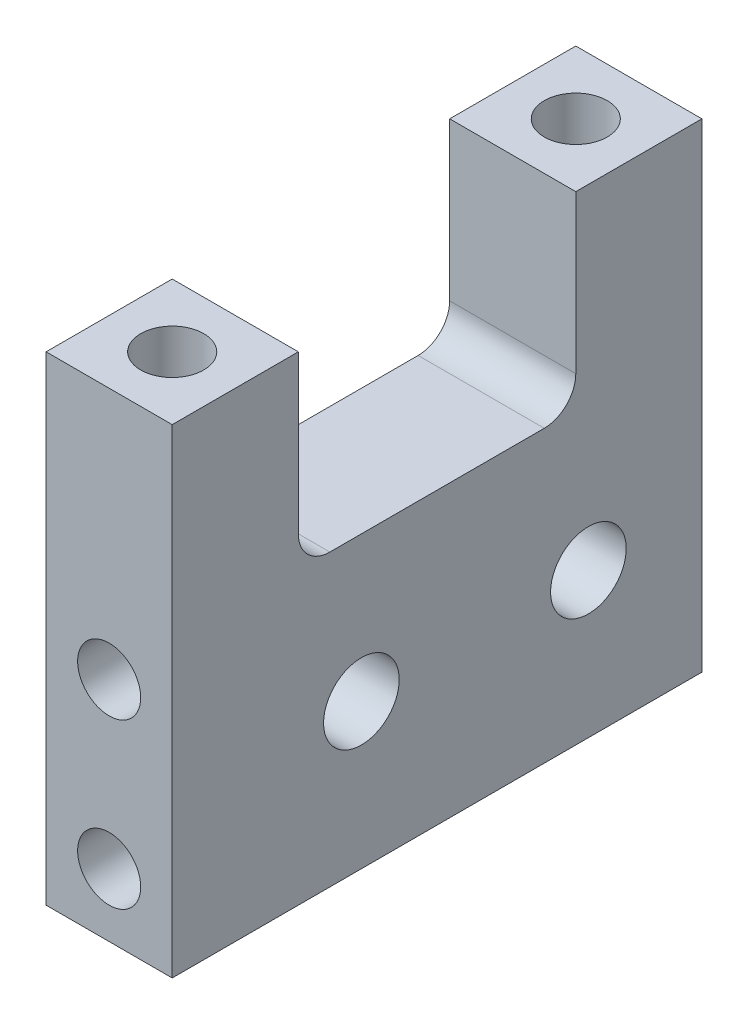
ISO-10303-21;
HEADER;
FILE_DESCRIPTION(('STEP AP214'),'2;1');
FILE_NAME('part.step','',(''),(''),'','','');
FILE_SCHEMA(('AUTOMOTIVE_DESIGN { 1 0 10303 214 1 1 1 1 }'));
ENDSEC;
DATA;
#1=APPLICATION_CONTEXT('core data for automotive mechanical design processes');
#2=APPLICATION_PROTOCOL_DEFINITION('international standard','automotive_design',2000,#1);
#3=PRODUCT_CONTEXT('',#1,'mechanical');
#4=PRODUCT('Part','Part','',(#3));
#5=PRODUCT_RELATED_PRODUCT_CATEGORY('part','',(#4));
#6=PRODUCT_DEFINITION_FORMATION('','',#4);
#7=PRODUCT_DEFINITION_CONTEXT('part definition',#1,'design');
#8=PRODUCT_DEFINITION('design','',#6,#7);
#9=PRODUCT_DEFINITION_SHAPE('','',#8);
#10=(LENGTH_UNIT() NAMED_UNIT(*) SI_UNIT(.MILLI.,.METRE.));
#11=(NAMED_UNIT(*) PLANE_ANGLE_UNIT() SI_UNIT($,.RADIAN.));
#12=(NAMED_UNIT(*) SI_UNIT($,.STERADIAN.) SOLID_ANGLE_UNIT());
#13=UNCERTAINTY_MEASURE_WITH_UNIT(LENGTH_MEASURE(1.E-05),#10,'distance_accuracy_value','');
#14=(GEOMETRIC_REPRESENTATION_CONTEXT(3) GLOBAL_UNCERTAINTY_ASSIGNED_CONTEXT((#13)) GLOBAL_UNIT_ASSIGNED_CONTEXT((#10,
#11,#12)) REPRESENTATION_CONTEXT('',''));
#15=CARTESIAN_POINT('',(0.,0.,0.));
#16=DIRECTION('',(0.,0.,1.));
#17=DIRECTION('',(1.,0.,0.));
#18=AXIS2_PLACEMENT_3D('',#15,#16,#17);
#19=CARTESIAN_POINT('',(10.,38.,0.));
#20=DIRECTION('',(0.,-1.,0.));
#21=DIRECTION('',(0.,0.,-1.));
#22=AXIS2_PLACEMENT_3D('',#19,#20,#21);
#23=PLANE('',#22);
#24=CARTESIAN_POINT('',(5.,38.,-37.));
#25=DIRECTION('',(0.,1.,0.));
#26=DIRECTION('',(0.,0.,1.));
#27=AXIS2_PLACEMENT_3D('',#24,#25,#26);
#28=CIRCLE('',#27,2.5);
#29=CARTESIAN_POINT('',(5.,38.,-34.5));
#30=VERTEX_POINT('',#29);
#31=EDGE_CURVE('E174',#30,#30,#28,.T.);
#32=ORIENTED_EDGE('',*,*,#31,.F.);
#33=EDGE_LOOP('',(#32));
#34=FACE_BOUND('',#33,.T.);
#35=DIRECTION('',(0.,0.,1.));
#36=VECTOR('',#35,1.);
#37=CARTESIAN_POINT('',(0.,38.,0.));
#38=LINE('',#37,#36);
#39=CARTESIAN_POINT('',(0.,38.,-42.));
#40=VERTEX_POINT('',#39);
#41=CARTESIAN_POINT('',(0.,38.,-32.));
#42=VERTEX_POINT('',#41);
#43=EDGE_CURVE('E202',#40,#42,#38,.T.);
#44=ORIENTED_EDGE('',*,*,#43,.T.);
#45=DIRECTION('',(1.,0.,0.));
#46=VECTOR('',#45,1.);
#47=CARTESIAN_POINT('',(10.,38.,-32.));
#48=LINE('',#47,#46);
#49=CARTESIAN_POINT('',(10.,38.,-32.));
#50=VERTEX_POINT('',#49);
#51=EDGE_CURVE('E170',#42,#50,#48,.T.);
#52=ORIENTED_EDGE('',*,*,#51,.T.);
#53=DIRECTION('',(0.,0.,1.));
#54=VECTOR('',#53,1.);
#55=CARTESIAN_POINT('',(10.,38.,0.));
#56=LINE('',#55,#54);
#57=CARTESIAN_POINT('',(10.,38.,-42.));
#58=VERTEX_POINT('',#57);
#59=EDGE_CURVE('E139',#58,#50,#56,.T.);
#60=ORIENTED_EDGE('',*,*,#59,.F.);
#61=DIRECTION('',(-1.,0.,0.));
#62=VECTOR('',#61,1.);
#63=CARTESIAN_POINT('',(10.,38.,-42.));
#64=LINE('',#63,#62);
#65=EDGE_CURVE('E220',#58,#40,#64,.T.);
#66=ORIENTED_EDGE('',*,*,#65,.T.);
#67=EDGE_LOOP('',(#44,#52,#60,#66));
#68=FACE_BOUND('',#67,.T.);
#69=ADVANCED_FACE('F32',(#34,#68),#23,.F.);
#70=CARTESIAN_POINT('',(10.,0.,0.));
#71=DIRECTION('',(0.,0.,-1.));
#72=DIRECTION('',(-1.,0.,0.));
#73=AXIS2_PLACEMENT_3D('',#70,#71,#72);
#74=PLANE('',#73);
#75=CARTESIAN_POINT('',(5.,18.,0.));
#76=DIRECTION('',(0.,0.,1.));
#77=DIRECTION('',(1.,0.,0.));
#78=AXIS2_PLACEMENT_3D('',#75,#76,#77);
#79=CIRCLE('',#78,2.5);
#80=CARTESIAN_POINT('',(7.5,18.,0.));
#81=VERTEX_POINT('',#80);
#82=EDGE_CURVE('E185',#81,#81,#79,.T.);
#83=ORIENTED_EDGE('',*,*,#82,.F.);
#84=EDGE_LOOP('',(#83));
#85=FACE_BOUND('',#84,.T.);
#86=CARTESIAN_POINT('',(5.,5.,0.));
#87=DIRECTION('',(0.,0.,1.));
#88=DIRECTION('',(1.,0.,0.));
#89=AXIS2_PLACEMENT_3D('',#86,#87,#88);
#90=CIRCLE('',#89,2.5);
#91=CARTESIAN_POINT('',(7.5,5.,0.));
#92=VERTEX_POINT('',#91);
#93=EDGE_CURVE('E189',#92,#92,#90,.T.);
#94=ORIENTED_EDGE('',*,*,#93,.F.);
#95=EDGE_LOOP('',(#94));
#96=FACE_BOUND('',#95,.T.);
#97=DIRECTION('',(0.,-1.,0.));
#98=VECTOR('',#97,1.);
#99=CARTESIAN_POINT('',(0.,0.,0.));
#100=LINE('',#99,#98);
#101=CARTESIAN_POINT('',(0.,38.,0.));
#102=VERTEX_POINT('',#101);
#103=CARTESIAN_POINT('',(0.,0.,0.));
#104=VERTEX_POINT('',#103);
#105=EDGE_CURVE('E195',#102,#104,#100,.T.);
#106=ORIENTED_EDGE('',*,*,#105,.T.);
#107=DIRECTION('',(-1.,0.,0.));
#108=VECTOR('',#107,1.);
#109=CARTESIAN_POINT('',(10.,0.,0.));
#110=LINE('',#109,#108);
#111=CARTESIAN_POINT('',(10.,0.,0.));
#112=VERTEX_POINT('',#111);
#113=EDGE_CURVE('E40',#112,#104,#110,.T.);
#114=ORIENTED_EDGE('',*,*,#113,.F.);
#115=DIRECTION('',(0.,-1.,0.));
#116=VECTOR('',#115,1.);
#117=CARTESIAN_POINT('',(10.,0.,0.));
#118=LINE('',#117,#116);
#119=CARTESIAN_POINT('',(10.,38.,0.));
#120=VERTEX_POINT('',#119);
#121=EDGE_CURVE('E198',#120,#112,#118,.T.);
#122=ORIENTED_EDGE('',*,*,#121,.F.);
#123=DIRECTION('',(-1.,0.,0.));
#124=VECTOR('',#123,1.);
#125=CARTESIAN_POINT('',(10.,38.,0.));
#126=LINE('',#125,#124);
#127=EDGE_CURVE('E208',#120,#102,#126,.T.);
#128=ORIENTED_EDGE('',*,*,#127,.T.);
#129=EDGE_LOOP('',(#106,#114,#122,#128));
#130=FACE_BOUND('',#129,.T.);
#131=ADVANCED_FACE('F34',(#85,#96,#130),#74,.F.);
#132=CARTESIAN_POINT('',(10.,0.,0.));
#133=DIRECTION('',(0.,1.,0.));
#134=DIRECTION('',(0.,0.,1.));
#135=AXIS2_PLACEMENT_3D('',#132,#133,#134);
#136=PLANE('',#135);
#137=DIRECTION('',(0.,0.,-1.));
#138=VECTOR('',#137,1.);
#139=CARTESIAN_POINT('',(0.,0.,0.));
#140=LINE('',#139,#138);
#141=CARTESIAN_POINT('',(0.,0.,-42.));
#142=VERTEX_POINT('',#141);
#143=EDGE_CURVE('E211',#104,#142,#140,.T.);
#144=ORIENTED_EDGE('',*,*,#143,.T.);
#145=DIRECTION('',(-1.,0.,0.));
#146=VECTOR('',#145,1.);
#147=CARTESIAN_POINT('',(10.,0.,-42.));
#148=LINE('',#147,#146);
#149=CARTESIAN_POINT('',(10.,0.,-42.));
#150=VERTEX_POINT('',#149);
#151=EDGE_CURVE('E223',#150,#142,#148,.T.);
#152=ORIENTED_EDGE('',*,*,#151,.F.);
#153=DIRECTION('',(0.,0.,-1.));
#154=VECTOR('',#153,1.);
#155=CARTESIAN_POINT('',(10.,0.,0.));
#156=LINE('',#155,#154);
#157=EDGE_CURVE('E201',#112,#150,#156,.T.);
#158=ORIENTED_EDGE('',*,*,#157,.F.);
#159=ORIENTED_EDGE('',*,*,#113,.T.);
#160=EDGE_LOOP('',(#144,#152,#158,#159));
#161=FACE_BOUND('',#160,.T.);
#162=ADVANCED_FACE('F228',(#161),#136,.F.);
#163=CARTESIAN_POINT('',(10.,0.,-42.));
#164=DIRECTION('',(0.,0.,1.));
#165=DIRECTION('',(1.,0.,0.));
#166=AXIS2_PLACEMENT_3D('',#163,#164,#165);
#167=PLANE('',#166);
#168=CARTESIAN_POINT('',(5.,18.,-42.));
#169=DIRECTION('',(0.,0.,1.));
#170=DIRECTION('',(1.,0.,0.));
#171=AXIS2_PLACEMENT_3D('',#168,#169,#170);
#172=CIRCLE('',#171,2.5);
#173=CARTESIAN_POINT('',(7.5,18.,-42.));
#174=VERTEX_POINT('',#173);
#175=EDGE_CURVE('E186',#174,#174,#172,.T.);
#176=ORIENTED_EDGE('',*,*,#175,.T.);
#177=EDGE_LOOP('',(#176));
#178=FACE_BOUND('',#177,.T.);
#179=CARTESIAN_POINT('',(5.,5.,-42.));
#180=DIRECTION('',(0.,0.,1.));
#181=DIRECTION('',(1.,0.,0.));
#182=AXIS2_PLACEMENT_3D('',#179,#180,#181);
#183=CIRCLE('',#182,2.5);
#184=CARTESIAN_POINT('',(7.5,5.,-42.));
#185=VERTEX_POINT('',#184);
#186=EDGE_CURVE('E192',#185,#185,#183,.T.);
#187=ORIENTED_EDGE('',*,*,#186,.T.);
#188=EDGE_LOOP('',(#187));
#189=FACE_BOUND('',#188,.T.);
#190=DIRECTION('',(0.,1.,0.));
#191=VECTOR('',#190,1.);
#192=CARTESIAN_POINT('',(0.,0.,-42.));
#193=LINE('',#192,#191);
#194=EDGE_CURVE('E213',#142,#40,#193,.T.);
#195=ORIENTED_EDGE('',*,*,#194,.T.);
#196=ORIENTED_EDGE('',*,*,#65,.F.);
#197=DIRECTION('',(0.,1.,0.));
#198=VECTOR('',#197,1.);
#199=CARTESIAN_POINT('',(10.,0.,-42.));
#200=LINE('',#199,#198);
#201=EDGE_CURVE('E204',#150,#58,#200,.T.);
#202=ORIENTED_EDGE('',*,*,#201,.F.);
#203=ORIENTED_EDGE('',*,*,#151,.T.);
#204=EDGE_LOOP('',(#195,#196,#202,#203));
#205=FACE_BOUND('',#204,.T.);
#206=ADVANCED_FACE('F242',(#178,#189,#205),#167,.F.);
#207=CARTESIAN_POINT('',(5.,38.,-5.));
#208=DIRECTION('',(0.,1.,0.));
#209=DIRECTION('',(0.,0.,1.));
#210=AXIS2_PLACEMENT_3D('',#207,#208,#209);
#211=CIRCLE('',#210,2.5);
#212=CARTESIAN_POINT('',(5.,38.,-2.5));
#213=VERTEX_POINT('',#212);
#214=EDGE_CURVE('E181',#213,#213,#211,.T.);
#215=ORIENTED_EDGE('',*,*,#214,.F.);
#216=EDGE_LOOP('',(#215));
#217=FACE_BOUND('',#216,.T.);
#218=CARTESIAN_POINT('',(10.,38.,-10.));
#219=VERTEX_POINT('',#218);
#220=EDGE_CURVE('E206',#219,#120,#56,.T.);
#221=ORIENTED_EDGE('',*,*,#220,.F.);
#222=DIRECTION('',(-1.,0.,0.));
#223=VECTOR('',#222,1.);
#224=CARTESIAN_POINT('',(10.,38.,-10.));
#225=LINE('',#224,#223);
#226=CARTESIAN_POINT('',(0.,38.,-10.));
#227=VERTEX_POINT('',#226);
#228=EDGE_CURVE('E164',#219,#227,#225,.T.);
#229=ORIENTED_EDGE('',*,*,#228,.T.);
#230=EDGE_CURVE('E215',#227,#102,#38,.T.);
#231=ORIENTED_EDGE('',*,*,#230,.T.);
#232=ORIENTED_EDGE('',*,*,#127,.F.);
#233=EDGE_LOOP('',(#221,#229,#231,#232));
#234=FACE_BOUND('',#233,.T.);
#235=ADVANCED_FACE('F257',(#217,#234),#23,.F.);
#236=CARTESIAN_POINT('',(10.,38.,0.));
#237=DIRECTION('',(-1.,0.,0.));
#238=DIRECTION('',(0.,0.,1.));
#239=AXIS2_PLACEMENT_3D('',#236,#237,#238);
#240=PLANE('',#239);
#241=CARTESIAN_POINT('',(10.,11.5,-15.));
#242=DIRECTION('',(-1.,0.,0.));
#243=DIRECTION('',(0.,0.,1.));
#244=AXIS2_PLACEMENT_3D('',#241,#242,#243);
#245=CIRCLE('',#244,3.);
#246=CARTESIAN_POINT('',(10.,11.5,-12.));
#247=VERTEX_POINT('',#246);
#248=EDGE_CURVE('E310',#247,#247,#245,.T.);
#249=ORIENTED_EDGE('',*,*,#248,.T.);
#250=EDGE_LOOP('',(#249));
#251=FACE_BOUND('',#250,.T.);
#252=CARTESIAN_POINT('',(10.,11.5,-33.));
#253=DIRECTION('',(-1.,0.,0.));
#254=DIRECTION('',(0.,0.,1.));
#255=AXIS2_PLACEMENT_3D('',#252,#253,#254);
#256=CIRCLE('',#255,3.);
#257=CARTESIAN_POINT('',(10.,11.5,-30.));
#258=VERTEX_POINT('',#257);
#259=EDGE_CURVE('E157',#258,#258,#256,.T.);
#260=ORIENTED_EDGE('',*,*,#259,.T.);
#261=EDGE_LOOP('',(#260));
#262=FACE_BOUND('',#261,.T.);
#263=ORIENTED_EDGE('',*,*,#59,.T.);
#264=DIRECTION('',(0.,-1.,0.));
#265=VECTOR('',#264,1.);
#266=CARTESIAN_POINT('',(10.,40.0629630143128,-32.));
#267=LINE('',#266,#265);
#268=CARTESIAN_POINT('',(10.,25.5,-32.));
#269=VERTEX_POINT('',#268);
#270=EDGE_CURVE('E121',#50,#269,#267,.T.);
#271=ORIENTED_EDGE('',*,*,#270,.T.);
#272=CARTESIAN_POINT('',(10.,25.5,-29.5));
#273=DIRECTION('',(-1.,0.,0.));
#274=DIRECTION('',(0.,0.,1.));
#275=AXIS2_PLACEMENT_3D('',#272,#273,#274);
#276=CIRCLE('',#275,2.5);
#277=CARTESIAN_POINT('',(10.,23.,-29.5));
#278=VERTEX_POINT('',#277);
#279=EDGE_CURVE('E129',#269,#278,#276,.T.);
#280=ORIENTED_EDGE('',*,*,#279,.T.);
#281=DIRECTION('',(0.,0.,1.));
#282=VECTOR('',#281,1.);
#283=CARTESIAN_POINT('',(10.,23.,-29.5));
#284=LINE('',#283,#282);
#285=CARTESIAN_POINT('',(10.,23.,-12.5));
#286=VERTEX_POINT('',#285);
#287=EDGE_CURVE('E134',#278,#286,#284,.T.);
#288=ORIENTED_EDGE('',*,*,#287,.T.);
#289=CARTESIAN_POINT('',(10.,25.5,-12.5));
#290=DIRECTION('',(-1.,0.,0.));
#291=DIRECTION('',(0.,0.,1.));
#292=AXIS2_PLACEMENT_3D('',#289,#290,#291);
#293=CIRCLE('',#292,2.5);
#294=CARTESIAN_POINT('',(10.,25.5,-10.));
#295=VERTEX_POINT('',#294);
#296=EDGE_CURVE('E149',#286,#295,#293,.T.);
#297=ORIENTED_EDGE('',*,*,#296,.T.);
#298=DIRECTION('',(0.,1.,0.));
#299=VECTOR('',#298,1.);
#300=CARTESIAN_POINT('',(10.,40.0629630143128,-10.));
#301=LINE('',#300,#299);
#302=EDGE_CURVE('E126',#295,#219,#301,.T.);
#303=ORIENTED_EDGE('',*,*,#302,.T.);
#304=ORIENTED_EDGE('',*,*,#220,.T.);
#305=ORIENTED_EDGE('',*,*,#121,.T.);
#306=ORIENTED_EDGE('',*,*,#157,.T.);
#307=ORIENTED_EDGE('',*,*,#201,.T.);
#308=EDGE_LOOP('',(#263,#271,#280,#288,#297,#303,#304,#305,#306,#307));
#309=FACE_BOUND('',#308,.T.);
#310=ADVANCED_FACE('F137',(#251,#262,#309),#240,.F.);
#311=CARTESIAN_POINT('',(0.,38.,0.));
#312=DIRECTION('',(-1.,0.,0.));
#313=DIRECTION('',(0.,0.,1.));
#314=AXIS2_PLACEMENT_3D('',#311,#312,#313);
#315=PLANE('',#314);
#316=CARTESIAN_POINT('',(0.,11.5,-15.));
#317=DIRECTION('',(-1.,0.,0.));
#318=DIRECTION('',(0.,0.,1.));
#319=AXIS2_PLACEMENT_3D('',#316,#317,#318);
#320=CIRCLE('',#319,3.);
#321=CARTESIAN_POINT('',(0.,11.5,-12.));
#322=VERTEX_POINT('',#321);
#323=EDGE_CURVE('E306',#322,#322,#320,.T.);
#324=ORIENTED_EDGE('',*,*,#323,.F.);
#325=EDGE_LOOP('',(#324));
#326=FACE_BOUND('',#325,.T.);
#327=CARTESIAN_POINT('',(0.,11.5,-33.));
#328=DIRECTION('',(-1.,0.,0.));
#329=DIRECTION('',(0.,0.,1.));
#330=AXIS2_PLACEMENT_3D('',#327,#328,#329);
#331=CIRCLE('',#330,3.);
#332=CARTESIAN_POINT('',(0.,11.5,-30.));
#333=VERTEX_POINT('',#332);
#334=EDGE_CURVE('E145',#333,#333,#331,.T.);
#335=ORIENTED_EDGE('',*,*,#334,.F.);
#336=EDGE_LOOP('',(#335));
#337=FACE_BOUND('',#336,.T.);
#338=DIRECTION('',(0.,-1.,0.));
#339=VECTOR('',#338,1.);
#340=CARTESIAN_POINT('',(0.,38.,-32.));
#341=LINE('',#340,#339);
#342=CARTESIAN_POINT('',(0.,25.5,-32.));
#343=VERTEX_POINT('',#342);
#344=EDGE_CURVE('E11',#42,#343,#341,.T.);
#345=ORIENTED_EDGE('',*,*,#344,.F.);
#346=ORIENTED_EDGE('',*,*,#43,.F.);
#347=ORIENTED_EDGE('',*,*,#194,.F.);
#348=ORIENTED_EDGE('',*,*,#143,.F.);
#349=ORIENTED_EDGE('',*,*,#105,.F.);
#350=ORIENTED_EDGE('',*,*,#230,.F.);
#351=DIRECTION('',(0.,1.,0.));
#352=VECTOR('',#351,1.);
#353=CARTESIAN_POINT('',(0.,40.0629630143128,-10.));
#354=LINE('',#353,#352);
#355=CARTESIAN_POINT('',(0.,25.5,-10.));
#356=VERTEX_POINT('',#355);
#357=EDGE_CURVE('E140',#356,#227,#354,.T.);
#358=ORIENTED_EDGE('',*,*,#357,.F.);
#359=CARTESIAN_POINT('',(0.,25.5,-12.5));
#360=DIRECTION('',(-1.,0.,0.));
#361=DIRECTION('',(0.,0.,1.));
#362=AXIS2_PLACEMENT_3D('',#359,#360,#361);
#363=CIRCLE('',#362,2.5);
#364=CARTESIAN_POINT('',(0.,23.,-12.5));
#365=VERTEX_POINT('',#364);
#366=EDGE_CURVE('E142',#365,#356,#363,.T.);
#367=ORIENTED_EDGE('',*,*,#366,.F.);
#368=DIRECTION('',(0.,0.,1.));
#369=VECTOR('',#368,1.);
#370=CARTESIAN_POINT('',(0.,23.,-29.5));
#371=LINE('',#370,#369);
#372=CARTESIAN_POINT('',(0.,23.,-29.5));
#373=VERTEX_POINT('',#372);
#374=EDGE_CURVE('E156',#373,#365,#371,.T.);
#375=ORIENTED_EDGE('',*,*,#374,.F.);
#376=CARTESIAN_POINT('',(0.,25.5,-29.5));
#377=DIRECTION('',(-1.,0.,0.));
#378=DIRECTION('',(0.,0.,1.));
#379=AXIS2_PLACEMENT_3D('',#376,#377,#378);
#380=CIRCLE('',#379,2.5);
#381=EDGE_CURVE('E154',#343,#373,#380,.T.);
#382=ORIENTED_EDGE('',*,*,#381,.F.);
#383=EDGE_LOOP('',(#345,#346,#347,#348,#349,#350,#358,#367,#375,#382));
#384=FACE_BOUND('',#383,.T.);
#385=ADVANCED_FACE('F236',(#326,#337,#384),#315,.T.);
#386=CARTESIAN_POINT('',(5.,5.,-42.));
#387=DIRECTION('',(0.,0.,1.));
#388=DIRECTION('',(1.,0.,0.));
#389=AXIS2_PLACEMENT_3D('',#386,#387,#388);
#390=CYLINDRICAL_SURFACE('',#389,2.5);
#391=CARTESIAN_POINT('',(7.5,5.,-42.));
#392=CARTESIAN_POINT('',(7.5,5.,-41.5625));
#393=CARTESIAN_POINT('',(7.5,5.,-41.125));
#394=CARTESIAN_POINT('',(7.5,5.,-40.25));
#395=CARTESIAN_POINT('',(7.5,5.,-39.8125));
#396=CARTESIAN_POINT('',(7.5,5.,-38.9375));
#397=CARTESIAN_POINT('',(7.5,5.,-38.5));
#398=CARTESIAN_POINT('',(7.5,5.,-37.625));
#399=CARTESIAN_POINT('',(7.5,5.,-37.1875));
#400=CARTESIAN_POINT('',(7.5,5.,-36.3125));
#401=CARTESIAN_POINT('',(7.5,5.,-35.875));
#402=CARTESIAN_POINT('',(7.5,5.,-35.));
#403=CARTESIAN_POINT('',(7.5,5.,-34.5625));
#404=CARTESIAN_POINT('',(7.5,5.,-33.6875));
#405=CARTESIAN_POINT('',(7.5,5.,-33.25));
#406=CARTESIAN_POINT('',(7.5,5.,-32.375));
#407=CARTESIAN_POINT('',(7.5,5.,-31.9375));
#408=CARTESIAN_POINT('',(7.5,5.,-31.0625));
#409=CARTESIAN_POINT('',(7.5,5.,-30.625));
#410=CARTESIAN_POINT('',(7.5,5.,-29.75));
#411=CARTESIAN_POINT('',(7.5,5.,-29.3125));
#412=CARTESIAN_POINT('',(7.5,5.,-28.4375));
#413=CARTESIAN_POINT('',(7.5,5.,-28.));
#414=CARTESIAN_POINT('',(7.5,5.,-27.125));
#415=CARTESIAN_POINT('',(7.5,5.,-26.6875));
#416=CARTESIAN_POINT('',(7.5,5.,-25.8125));
#417=CARTESIAN_POINT('',(7.5,5.,-25.375));
#418=CARTESIAN_POINT('',(7.5,5.,-24.5));
#419=CARTESIAN_POINT('',(7.5,5.,-24.0625));
#420=CARTESIAN_POINT('',(7.5,5.,-23.1875));
#421=CARTESIAN_POINT('',(7.5,5.,-22.75));
#422=CARTESIAN_POINT('',(7.5,5.,-21.875));
#423=CARTESIAN_POINT('',(7.5,5.,-21.4375));
#424=CARTESIAN_POINT('',(7.5,5.,-20.5625));
#425=CARTESIAN_POINT('',(7.5,5.,-20.125));
#426=CARTESIAN_POINT('',(7.5,5.,-19.25));
#427=CARTESIAN_POINT('',(7.5,5.,-18.8125));
#428=CARTESIAN_POINT('',(7.5,5.,-17.9375));
#429=CARTESIAN_POINT('',(7.5,5.,-17.5));
#430=CARTESIAN_POINT('',(7.5,5.,-16.625));
#431=CARTESIAN_POINT('',(7.5,5.,-16.1875));
#432=CARTESIAN_POINT('',(7.5,5.,-15.3125));
#433=CARTESIAN_POINT('',(7.5,5.,-14.875));
#434=CARTESIAN_POINT('',(7.5,5.,-14.));
#435=CARTESIAN_POINT('',(7.5,5.,-13.5625));
#436=CARTESIAN_POINT('',(7.5,5.,-12.6875));
#437=CARTESIAN_POINT('',(7.5,5.,-12.25));
#438=CARTESIAN_POINT('',(7.5,5.,-11.375));
#439=CARTESIAN_POINT('',(7.5,5.,-10.9375));
#440=CARTESIAN_POINT('',(7.5,5.,-10.0625));
#441=CARTESIAN_POINT('',(7.5,5.,-9.625));
#442=CARTESIAN_POINT('',(7.5,5.,-8.75));
#443=CARTESIAN_POINT('',(7.5,5.,-8.3125));
#444=CARTESIAN_POINT('',(7.5,5.,-7.4375));
#445=CARTESIAN_POINT('',(7.5,5.,-7.));
#446=CARTESIAN_POINT('',(7.5,5.,-6.12500000000001));
#447=CARTESIAN_POINT('',(7.5,5.,-5.68750000000001));
#448=CARTESIAN_POINT('',(7.5,5.,-4.8125));
#449=CARTESIAN_POINT('',(7.5,5.,-4.375));
#450=CARTESIAN_POINT('',(7.5,5.,-3.5));
#451=CARTESIAN_POINT('',(7.5,5.,-3.0625));
#452=CARTESIAN_POINT('',(7.5,5.,-2.1875));
#453=CARTESIAN_POINT('',(7.5,5.,-1.75));
#454=CARTESIAN_POINT('',(7.5,5.,-0.875000000000001));
#455=CARTESIAN_POINT('',(7.5,5.,-0.4375));
#456=CARTESIAN_POINT('',(7.5,5.,0.));
#457=B_SPLINE_CURVE_WITH_KNOTS('',3,(#391,#392,#393,#394,#395,#396,#397,#398,#399,#400,#401,
#402,#403,#404,#405,#406,#407,#408,#409,#410,#411,#412,#413,#414,#415,#416,#417,#418,#419,#420,
#421,#422,#423,#424,#425,#426,#427,#428,#429,#430,#431,#432,#433,#434,#435,#436,#437,#438,#439,
#440,#441,#442,#443,#444,#445,#446,#447,#448,#449,#450,#451,#452,#453,#454,#455,#456),
.UNSPECIFIED.,.F.,.F.,(4,2,2,2,2,2,2,2,2,2,2,2,2,2,2,2,2,2,2,2,2,2,2,2,2,2,2,2,2,2,2,2,4),(0.,
1.3125,2.625,3.9375,5.25,6.56250000000001,7.87500000000001,9.1875,10.5,11.8125,13.125,14.4375,
15.75,17.0625,18.375,19.6875,21.,22.3125,23.625,24.9375,26.25,27.5625,28.875,30.1875,31.5,
32.8125,34.125,35.4375,36.75,38.0625,39.375,40.6875,42.),.UNSPECIFIED.);
#458=EDGE_CURVE('BSEAM295',#185,#92,#457,.T.);
#459=ORIENTED_EDGE('',*,*,#186,.F.);
#460=ORIENTED_EDGE('',*,*,#93,.T.);
#461=ORIENTED_EDGE('',*,*,#458,.T.);
#462=ORIENTED_EDGE('',*,*,#458,.F.);
#463=EDGE_LOOP('',(#459,#461,#460,#462));
#464=FACE_BOUND('',#463,.T.);
#465=ADVANCED_FACE('F295',(#464),#390,.F.);
#466=CARTESIAN_POINT('',(5.,18.,-42.));
#467=DIRECTION('',(0.,0.,1.));
#468=DIRECTION('',(1.,0.,0.));
#469=AXIS2_PLACEMENT_3D('',#466,#467,#468);
#470=CYLINDRICAL_SURFACE('',#469,2.5);
#471=CARTESIAN_POINT('',(5.,18.,-37.));
#472=DIRECTION('',(0.,0.707106781186548,-0.707106781186547));
#473=DIRECTION('',(0.,0.707106781186548,0.707106781186547));
#474=AXIS2_PLACEMENT_3D('',#471,#472,#473);
#475=ELLIPSE('',#474,3.53553390593274,2.5);
#476=CARTESIAN_POINT('',(7.5,18.,-37.));
#477=VERTEX_POINT('',#476);
#478=CARTESIAN_POINT('',(2.5,18.,-37.));
#479=VERTEX_POINT('',#478);
#480=EDGE_CURVE('E172',#477,#479,#475,.F.);
#481=ORIENTED_EDGE('',*,*,#480,.F.);
#482=CARTESIAN_POINT('',(5.,18.,-37.));
#483=DIRECTION('',(0.,0.707106781186548,0.707106781186547));
#484=DIRECTION('',(0.,0.707106781186548,-0.707106781186547));
#485=AXIS2_PLACEMENT_3D('',#482,#483,#484);
#486=ELLIPSE('',#485,3.53553390593274,2.5);
#487=EDGE_CURVE('E53',#479,#477,#486,.F.);
#488=ORIENTED_EDGE('',*,*,#487,.F.);
#489=EDGE_LOOP('',(#481,#488));
#490=FACE_BOUND('',#489,.T.);
#491=CARTESIAN_POINT('',(5.,18.,-5.));
#492=DIRECTION('',(0.,0.707106781186548,-0.707106781186547));
#493=DIRECTION('',(0.,0.707106781186548,0.707106781186547));
#494=AXIS2_PLACEMENT_3D('',#491,#492,#493);
#495=ELLIPSE('',#494,3.53553390593274,2.5);
#496=CARTESIAN_POINT('',(7.5,18.,-5.));
#497=VERTEX_POINT('',#496);
#498=CARTESIAN_POINT('',(2.5,18.,-5.));
#499=VERTEX_POINT('',#498);
#500=EDGE_CURVE('E178',#497,#499,#495,.F.);
#501=ORIENTED_EDGE('',*,*,#500,.F.);
#502=CARTESIAN_POINT('',(5.,18.,-5.));
#503=DIRECTION('',(0.,0.707106781186548,0.707106781186547));
#504=DIRECTION('',(0.,0.707106781186548,-0.707106781186547));
#505=AXIS2_PLACEMENT_3D('',#502,#503,#504);
#506=ELLIPSE('',#505,3.53553390593274,2.5);
#507=EDGE_CURVE('E179',#499,#497,#506,.F.);
#508=ORIENTED_EDGE('',*,*,#507,.F.);
#509=EDGE_LOOP('',(#501,#508));
#510=FACE_BOUND('',#509,.T.);
#511=ORIENTED_EDGE('',*,*,#175,.F.);
#512=EDGE_LOOP('',(#511));
#513=FACE_BOUND('',#512,.T.);
#514=ORIENTED_EDGE('',*,*,#82,.T.);
#515=EDGE_LOOP('',(#514));
#516=FACE_BOUND('',#515,.T.);
#517=ADVANCED_FACE('F288',(#490,#510,#513,#516),#470,.F.);
#518=CARTESIAN_POINT('',(5.,-0.001000000000001,-5.));
#519=DIRECTION('',(0.,1.,0.));
#520=DIRECTION('',(0.,0.,1.));
#521=AXIS2_PLACEMENT_3D('',#518,#519,#520);
#522=CYLINDRICAL_SURFACE('',#521,2.5);
#523=ORIENTED_EDGE('',*,*,#214,.T.);
#524=EDGE_LOOP('',(#523));
#525=FACE_BOUND('',#524,.T.);
#526=ORIENTED_EDGE('',*,*,#507,.T.);
#527=ORIENTED_EDGE('',*,*,#500,.T.);
#528=EDGE_LOOP('',(#526,#527));
#529=FACE_BOUND('',#528,.T.);
#530=ADVANCED_FACE('F281',(#525,#529),#522,.F.);
#531=CARTESIAN_POINT('',(5.,-0.001000000000001,-37.));
#532=DIRECTION('',(0.,1.,0.));
#533=DIRECTION('',(0.,0.,1.));
#534=AXIS2_PLACEMENT_3D('',#531,#532,#533);
#535=CYLINDRICAL_SURFACE('',#534,2.5);
#536=ORIENTED_EDGE('',*,*,#31,.T.);
#537=EDGE_LOOP('',(#536));
#538=FACE_BOUND('',#537,.T.);
#539=ORIENTED_EDGE('',*,*,#487,.T.);
#540=ORIENTED_EDGE('',*,*,#480,.T.);
#541=EDGE_LOOP('',(#539,#540));
#542=FACE_BOUND('',#541,.T.);
#543=ADVANCED_FACE('F279',(#538,#542),#535,.F.);
#544=CARTESIAN_POINT('',(10.,40.0629630143128,-32.));
#545=DIRECTION('',(0.,0.,-1.));
#546=DIRECTION('',(-1.,0.,0.));
#547=AXIS2_PLACEMENT_3D('',#544,#545,#546);
#548=PLANE('',#547);
#549=ORIENTED_EDGE('',*,*,#344,.T.);
#550=DIRECTION('',(-1.,0.,0.));
#551=VECTOR('',#550,1.);
#552=CARTESIAN_POINT('',(10.,25.5,-32.));
#553=LINE('',#552,#551);
#554=EDGE_CURVE('E47',#269,#343,#553,.T.);
#555=ORIENTED_EDGE('',*,*,#554,.F.);
#556=ORIENTED_EDGE('',*,*,#270,.F.);
#557=ORIENTED_EDGE('',*,*,#51,.F.);
#558=EDGE_LOOP('',(#549,#555,#556,#557));
#559=FACE_BOUND('',#558,.T.);
#560=ADVANCED_FACE('F119',(#559),#548,.F.);
#561=CARTESIAN_POINT('',(10.,40.0629630143128,-10.));
#562=DIRECTION('',(0.,0.,1.));
#563=DIRECTION('',(0.,-1.,0.));
#564=AXIS2_PLACEMENT_3D('',#561,#562,#563);
#565=PLANE('',#564);
#566=ORIENTED_EDGE('',*,*,#302,.F.);
#567=DIRECTION('',(-1.,0.,0.));
#568=VECTOR('',#567,1.);
#569=CARTESIAN_POINT('',(10.,25.5,-10.));
#570=LINE('',#569,#568);
#571=EDGE_CURVE('E162',#295,#356,#570,.T.);
#572=ORIENTED_EDGE('',*,*,#571,.T.);
#573=ORIENTED_EDGE('',*,*,#357,.T.);
#574=ORIENTED_EDGE('',*,*,#228,.F.);
#575=EDGE_LOOP('',(#566,#572,#573,#574));
#576=FACE_BOUND('',#575,.T.);
#577=ADVANCED_FACE('F255',(#576),#565,.F.);
#578=CARTESIAN_POINT('',(10.,25.5,-12.5));
#579=DIRECTION('',(-1.,0.,0.));
#580=DIRECTION('',(0.,0.,1.));
#581=AXIS2_PLACEMENT_3D('',#578,#579,#580);
#582=CYLINDRICAL_SURFACE('',#581,2.5);
#583=ORIENTED_EDGE('',*,*,#366,.T.);
#584=ORIENTED_EDGE('',*,*,#571,.F.);
#585=ORIENTED_EDGE('',*,*,#296,.F.);
#586=DIRECTION('',(-1.,0.,0.));
#587=VECTOR('',#586,1.);
#588=CARTESIAN_POINT('',(10.,23.,-12.5));
#589=LINE('',#588,#587);
#590=EDGE_CURVE('E165',#286,#365,#589,.T.);
#591=ORIENTED_EDGE('',*,*,#590,.T.);
#592=EDGE_LOOP('',(#583,#584,#585,#591));
#593=FACE_BOUND('',#592,.T.);
#594=ADVANCED_FACE('F253',(#593),#582,.F.);
#595=CARTESIAN_POINT('',(10.,23.,-29.5));
#596=DIRECTION('',(0.,-1.,0.));
#597=DIRECTION('',(0.,0.,-1.));
#598=AXIS2_PLACEMENT_3D('',#595,#596,#597);
#599=PLANE('',#598);
#600=ORIENTED_EDGE('',*,*,#374,.T.);
#601=ORIENTED_EDGE('',*,*,#590,.F.);
#602=ORIENTED_EDGE('',*,*,#287,.F.);
#603=DIRECTION('',(-1.,0.,0.));
#604=VECTOR('',#603,1.);
#605=CARTESIAN_POINT('',(10.,23.,-29.5));
#606=LINE('',#605,#604);
#607=EDGE_CURVE('E125',#278,#373,#606,.T.);
#608=ORIENTED_EDGE('',*,*,#607,.T.);
#609=EDGE_LOOP('',(#600,#601,#602,#608));
#610=FACE_BOUND('',#609,.T.);
#611=ADVANCED_FACE('F248',(#610),#599,.F.);
#612=CARTESIAN_POINT('',(10.,25.5,-29.5));
#613=DIRECTION('',(-1.,0.,0.));
#614=DIRECTION('',(0.,0.,1.));
#615=AXIS2_PLACEMENT_3D('',#612,#613,#614);
#616=CYLINDRICAL_SURFACE('',#615,2.5);
#617=ORIENTED_EDGE('',*,*,#381,.T.);
#618=ORIENTED_EDGE('',*,*,#607,.F.);
#619=ORIENTED_EDGE('',*,*,#279,.F.);
#620=ORIENTED_EDGE('',*,*,#554,.T.);
#621=EDGE_LOOP('',(#617,#618,#619,#620));
#622=FACE_BOUND('',#621,.T.);
#623=ADVANCED_FACE('F130',(#622),#616,.F.);
#624=CARTESIAN_POINT('',(10.,11.5,-33.));
#625=DIRECTION('',(-1.,0.,0.));
#626=DIRECTION('',(0.,0.,1.));
#627=AXIS2_PLACEMENT_3D('',#624,#625,#626);
#628=CYLINDRICAL_SURFACE('',#627,3.);
#629=ORIENTED_EDGE('',*,*,#259,.F.);
#630=EDGE_LOOP('',(#629));
#631=FACE_BOUND('',#630,.T.);
#632=ORIENTED_EDGE('',*,*,#334,.T.);
#633=EDGE_LOOP('',(#632));
#634=FACE_BOUND('',#633,.T.);
#635=ADVANCED_FACE('F319',(#631,#634),#628,.F.);
#636=CARTESIAN_POINT('',(10.,11.5,-15.));
#637=DIRECTION('',(-1.,0.,0.));
#638=DIRECTION('',(0.,0.,1.));
#639=AXIS2_PLACEMENT_3D('',#636,#637,#638);
#640=CYLINDRICAL_SURFACE('',#639,3.);
#641=ORIENTED_EDGE('',*,*,#248,.F.);
#642=EDGE_LOOP('',(#641));
#643=FACE_BOUND('',#642,.T.);
#644=ORIENTED_EDGE('',*,*,#323,.T.);
#645=EDGE_LOOP('',(#644));
#646=FACE_BOUND('',#645,.T.);
#647=ADVANCED_FACE('F317',(#643,#646),#640,.F.);
#648=CLOSED_SHELL('',(#69,#131,#162,#206,#235,#310,#385,#465,#517,#530,#543,#560,#577,#594,#611,
#623,#635,#647));
#649=MANIFOLD_SOLID_BREP('B2',#648);
#650=ADVANCED_BREP_SHAPE_REPRESENTATION('',(#18,#649),#14);
#651=SHAPE_DEFINITION_REPRESENTATION(#9,#650);
ENDSEC;
END-ISO-10303-21;
